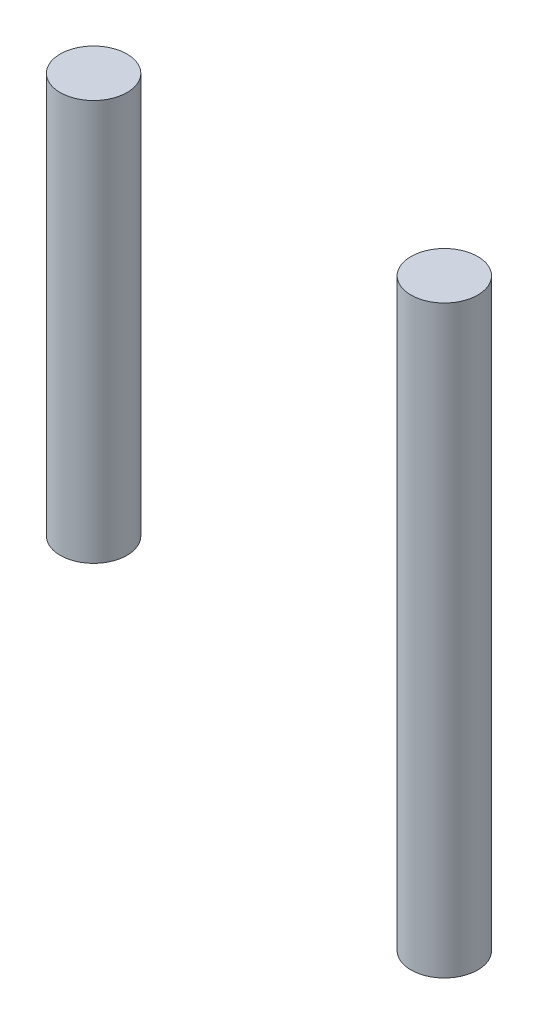
ISO-10303-21;
HEADER;
FILE_DESCRIPTION(('STEP AP214'),'2;1');
FILE_NAME('part.step','',(''),(''),'','','');
FILE_SCHEMA(('AUTOMOTIVE_DESIGN { 1 0 10303 214 1 1 1 1 }'));
ENDSEC;
DATA;
#1=APPLICATION_CONTEXT('core data for automotive mechanical design processes');
#2=APPLICATION_PROTOCOL_DEFINITION('international standard','automotive_design',2000,#1);
#3=PRODUCT_CONTEXT('',#1,'mechanical');
#4=PRODUCT('Part','Part','',(#3));
#5=PRODUCT_RELATED_PRODUCT_CATEGORY('part','',(#4));
#6=PRODUCT_DEFINITION_FORMATION('','',#4);
#7=PRODUCT_DEFINITION_CONTEXT('part definition',#1,'design');
#8=PRODUCT_DEFINITION('design','',#6,#7);
#9=PRODUCT_DEFINITION_SHAPE('','',#8);
#10=(LENGTH_UNIT() NAMED_UNIT(*) SI_UNIT(.MILLI.,.METRE.));
#11=(NAMED_UNIT(*) PLANE_ANGLE_UNIT() SI_UNIT($,.RADIAN.));
#12=(NAMED_UNIT(*) SI_UNIT($,.STERADIAN.) SOLID_ANGLE_UNIT());
#13=UNCERTAINTY_MEASURE_WITH_UNIT(LENGTH_MEASURE(1.E-05),#10,'distance_accuracy_value','');
#14=(GEOMETRIC_REPRESENTATION_CONTEXT(3) GLOBAL_UNCERTAINTY_ASSIGNED_CONTEXT((#13)) GLOBAL_UNIT_ASSIGNED_CONTEXT((#10,
#11,#12)) REPRESENTATION_CONTEXT('',''));
#15=CARTESIAN_POINT('',(0.,0.,0.));
#16=DIRECTION('',(0.,0.,1.));
#17=DIRECTION('',(1.,0.,0.));
#18=AXIS2_PLACEMENT_3D('',#15,#16,#17);
#19=CARTESIAN_POINT('',(10.5,-96.5,26.));
#20=DIRECTION('',(0.,-1.,0.));
#21=DIRECTION('',(0.,0.,-1.));
#22=AXIS2_PLACEMENT_3D('',#19,#20,#21);
#23=CYLINDRICAL_SURFACE('',#22,2.);
#24=CARTESIAN_POINT('',(10.5,-96.5,26.));
#25=DIRECTION('',(0.,1.,0.));
#26=DIRECTION('',(0.,0.,1.));
#27=AXIS2_PLACEMENT_3D('',#24,#25,#26);
#28=CIRCLE('',#27,2.);
#29=CARTESIAN_POINT('',(10.5,-96.5,28.));
#30=VERTEX_POINT('',#29);
#31=EDGE_CURVE('E11',#30,#30,#28,.T.);
#32=ORIENTED_EDGE('',*,*,#31,.F.);
#33=EDGE_LOOP('',(#32));
#34=FACE_BOUND('',#33,.T.);
#35=CARTESIAN_POINT('',(10.5,-131.5,26.));
#36=DIRECTION('',(0.,1.,0.));
#37=DIRECTION('',(0.,0.,1.));
#38=AXIS2_PLACEMENT_3D('',#35,#36,#37);
#39=CIRCLE('',#38,2.);
#40=CARTESIAN_POINT('',(10.5,-131.5,28.));
#41=VERTEX_POINT('',#40);
#42=EDGE_CURVE('E48',#41,#41,#39,.T.);
#43=ORIENTED_EDGE('',*,*,#42,.T.);
#44=EDGE_LOOP('',(#43));
#45=FACE_BOUND('',#44,.T.);
#46=ADVANCED_FACE('F45',(#34,#45),#23,.T.);
#47=CARTESIAN_POINT('',(10.5,-96.5,26.));
#48=DIRECTION('',(0.,1.,0.));
#49=DIRECTION('',(0.,0.,1.));
#50=AXIS2_PLACEMENT_3D('',#47,#48,#49);
#51=PLANE('',#50);
#52=ORIENTED_EDGE('',*,*,#31,.T.);
#53=EDGE_LOOP('',(#52));
#54=FACE_BOUND('',#53,.T.);
#55=ADVANCED_FACE('F60',(#54),#51,.T.);
#56=CARTESIAN_POINT('',(10.5,-131.5,26.));
#57=DIRECTION('',(0.,1.,0.));
#58=DIRECTION('',(0.,0.,1.));
#59=AXIS2_PLACEMENT_3D('',#56,#57,#58);
#60=PLANE('',#59);
#61=ORIENTED_EDGE('',*,*,#42,.F.);
#62=EDGE_LOOP('',(#61));
#63=FACE_BOUND('',#62,.T.);
#64=ADVANCED_FACE('F58',(#63),#60,.F.);
#65=CLOSED_SHELL('',(#46,#55,#64));
#66=MANIFOLD_SOLID_BREP('B2',#65);
#67=CARTESIAN_POINT('',(-10.5,-96.5,26.));
#68=DIRECTION('',(0.,-1.,0.));
#69=DIRECTION('',(0.,0.,-1.));
#70=AXIS2_PLACEMENT_3D('',#67,#68,#69);
#71=CYLINDRICAL_SURFACE('',#70,2.);
#72=CARTESIAN_POINT('',(-10.5,-96.5,26.));
#73=DIRECTION('',(0.,1.,0.));
#74=DIRECTION('',(0.,0.,1.));
#75=AXIS2_PLACEMENT_3D('',#72,#73,#74);
#76=CIRCLE('',#75,2.);
#77=CARTESIAN_POINT('',(-10.5,-96.5,28.));
#78=VERTEX_POINT('',#77);
#79=EDGE_CURVE('E44',#78,#78,#76,.T.);
#80=ORIENTED_EDGE('',*,*,#79,.F.);
#81=EDGE_LOOP('',(#80));
#82=FACE_BOUND('',#81,.T.);
#83=CARTESIAN_POINT('',(-10.5,-120.5,26.));
#84=DIRECTION('',(0.,1.,0.));
#85=DIRECTION('',(0.,0.,1.));
#86=AXIS2_PLACEMENT_3D('',#83,#84,#85);
#87=CIRCLE('',#86,2.);
#88=CARTESIAN_POINT('',(-10.5,-120.5,28.));
#89=VERTEX_POINT('',#88);
#90=EDGE_CURVE('E101',#89,#89,#87,.T.);
#91=ORIENTED_EDGE('',*,*,#90,.T.);
#92=EDGE_LOOP('',(#91));
#93=FACE_BOUND('',#92,.T.);
#94=ADVANCED_FACE('F98',(#82,#93),#71,.T.);
#95=CARTESIAN_POINT('',(-10.5,-96.5,26.));
#96=DIRECTION('',(0.,1.,0.));
#97=DIRECTION('',(0.,0.,1.));
#98=AXIS2_PLACEMENT_3D('',#95,#96,#97);
#99=PLANE('',#98);
#100=ORIENTED_EDGE('',*,*,#79,.T.);
#101=EDGE_LOOP('',(#100));
#102=FACE_BOUND('',#101,.T.);
#103=ADVANCED_FACE('F113',(#102),#99,.T.);
#104=CARTESIAN_POINT('',(-10.5,-120.5,26.));
#105=DIRECTION('',(0.,1.,0.));
#106=DIRECTION('',(0.,0.,1.));
#107=AXIS2_PLACEMENT_3D('',#104,#105,#106);
#108=PLANE('',#107);
#109=ORIENTED_EDGE('',*,*,#90,.F.);
#110=EDGE_LOOP('',(#109));
#111=FACE_BOUND('',#110,.T.);
#112=ADVANCED_FACE('F111',(#111),#108,.F.);
#113=CLOSED_SHELL('',(#94,#103,#112));
#114=MANIFOLD_SOLID_BREP('B6',#113);
#115=ADVANCED_BREP_SHAPE_REPRESENTATION('',(#18,#66,#114),#14);
#116=SHAPE_DEFINITION_REPRESENTATION(#9,#115);
ENDSEC;
END-ISO-10303-21;
